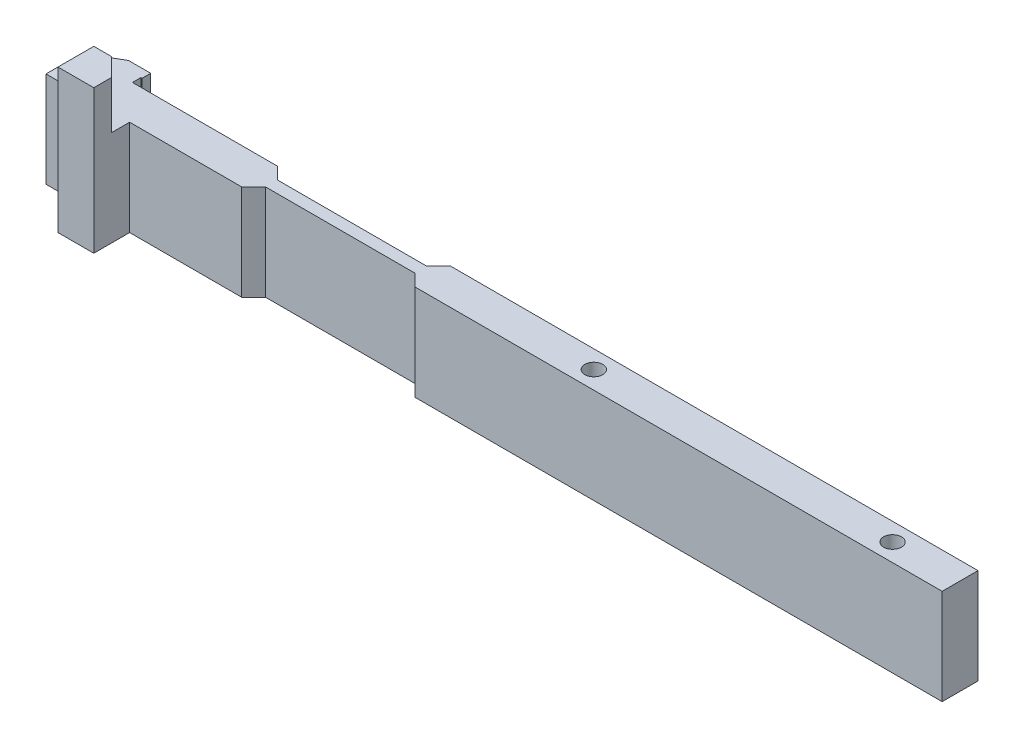
ISO-10303-21;
HEADER;
FILE_DESCRIPTION(('STEP AP214'),'2;1');
FILE_NAME('part.step','',(''),(''),'','','');
FILE_SCHEMA(('AUTOMOTIVE_DESIGN { 1 0 10303 214 1 1 1 1 }'));
ENDSEC;
DATA;
#1=APPLICATION_CONTEXT('core data for automotive mechanical design processes');
#2=APPLICATION_PROTOCOL_DEFINITION('international standard','automotive_design',2000,#1);
#3=PRODUCT_CONTEXT('',#1,'mechanical');
#4=PRODUCT('Part','Part','',(#3));
#5=PRODUCT_RELATED_PRODUCT_CATEGORY('part','',(#4));
#6=PRODUCT_DEFINITION_FORMATION('','',#4);
#7=PRODUCT_DEFINITION_CONTEXT('part definition',#1,'design');
#8=PRODUCT_DEFINITION('design','',#6,#7);
#9=PRODUCT_DEFINITION_SHAPE('','',#8);
#10=(LENGTH_UNIT() NAMED_UNIT(*) SI_UNIT(.MILLI.,.METRE.));
#11=(NAMED_UNIT(*) PLANE_ANGLE_UNIT() SI_UNIT($,.RADIAN.));
#12=(NAMED_UNIT(*) SI_UNIT($,.STERADIAN.) SOLID_ANGLE_UNIT());
#13=UNCERTAINTY_MEASURE_WITH_UNIT(LENGTH_MEASURE(1.E-05),#10,'distance_accuracy_value','');
#14=(GEOMETRIC_REPRESENTATION_CONTEXT(3) GLOBAL_UNCERTAINTY_ASSIGNED_CONTEXT((#13)) GLOBAL_UNIT_ASSIGNED_CONTEXT((#10,
#11,#12)) REPRESENTATION_CONTEXT('',''));
#15=CARTESIAN_POINT('',(0.,0.,0.));
#16=DIRECTION('',(0.,0.,1.));
#17=DIRECTION('',(1.,0.,0.));
#18=AXIS2_PLACEMENT_3D('',#15,#16,#17);
#19=CARTESIAN_POINT('',(0.,16.,0.));
#20=DIRECTION('',(0.,-1.,0.));
#21=DIRECTION('',(0.,0.,-1.));
#22=AXIS2_PLACEMENT_3D('',#19,#20,#21);
#23=PLANE('',#22);
#24=CARTESIAN_POINT('',(8.69910321486389,16.,3.00376550449415));
#25=DIRECTION('',(0.,1.,0.));
#26=DIRECTION('',(0.,0.,1.));
#27=AXIS2_PLACEMENT_3D('',#24,#25,#26);
#28=CIRCLE('',#27,1.5);
#29=CARTESIAN_POINT('',(8.69910321486389,16.,4.50376550449416));
#30=VERTEX_POINT('',#29);
#31=EDGE_CURVE('E271',#30,#30,#28,.T.);
#32=ORIENTED_EDGE('',*,*,#31,.F.);
#33=EDGE_LOOP('',(#32));
#34=FACE_BOUND('',#33,.T.);
#35=CARTESIAN_POINT('',(58.6991032148639,16.,3.00376550449415));
#36=DIRECTION('',(0.,1.,0.));
#37=DIRECTION('',(0.,0.,1.));
#38=AXIS2_PLACEMENT_3D('',#35,#36,#37);
#39=CIRCLE('',#38,1.5);
#40=CARTESIAN_POINT('',(58.6991032148639,16.,4.50376550449415));
#41=VERTEX_POINT('',#40);
#42=EDGE_CURVE('E238',#41,#41,#39,.T.);
#43=ORIENTED_EDGE('',*,*,#42,.F.);
#44=EDGE_LOOP('',(#43));
#45=FACE_BOUND('',#44,.T.);
#46=DIRECTION('',(-1.,0.,0.));
#47=VECTOR('',#46,1.);
#48=CARTESIAN_POINT('',(-72.,16.,6.));
#49=LINE('',#48,#47);
#50=CARTESIAN_POINT('',(-69.,16.,6.));
#51=VERTEX_POINT('',#50);
#52=CARTESIAN_POINT('',(-72.,16.,6.));
#53=VERTEX_POINT('',#52);
#54=EDGE_CURVE('E219',#51,#53,#49,.T.);
#55=ORIENTED_EDGE('',*,*,#54,.F.);
#56=DIRECTION('',(-0.707106781186549,0.,-0.707106781186546));
#57=VECTOR('',#56,1.);
#58=CARTESIAN_POINT('',(-69.,16.,6.));
#59=LINE('',#58,#57);
#60=CARTESIAN_POINT('',(-66.,16.,9.));
#61=VERTEX_POINT('',#60);
#62=EDGE_CURVE('E53',#61,#51,#59,.T.);
#63=ORIENTED_EDGE('',*,*,#62,.F.);
#64=DIRECTION('',(0.,0.,-1.));
#65=VECTOR('',#64,1.);
#66=CARTESIAN_POINT('',(-66.,16.,12.));
#67=LINE('',#66,#65);
#68=CARTESIAN_POINT('',(-66.,16.,6.));
#69=VERTEX_POINT('',#68);
#70=EDGE_CURVE('E57',#61,#69,#67,.T.);
#71=ORIENTED_EDGE('',*,*,#70,.T.);
#72=DIRECTION('',(1.,0.,0.));
#73=VECTOR('',#72,1.);
#74=CARTESIAN_POINT('',(-80.,16.,6.));
#75=LINE('',#74,#73);
#76=CARTESIAN_POINT('',(-47.2356614630942,16.,6.));
#77=VERTEX_POINT('',#76);
#78=EDGE_CURVE('E334',#69,#77,#75,.T.);
#79=ORIENTED_EDGE('',*,*,#78,.T.);
#80=DIRECTION('',(-0.707106781186558,0.,0.707106781186537));
#81=VECTOR('',#80,1.);
#82=CARTESIAN_POINT('',(-47.2431924720825,16.,6.00753100898831));
#83=LINE('',#82,#81);
#84=CARTESIAN_POINT('',(-45.2394269675883,16.,4.00376550449416));
#85=VERTEX_POINT('',#84);
#86=EDGE_CURVE('E286',#85,#77,#83,.T.);
#87=ORIENTED_EDGE('',*,*,#86,.F.);
#88=DIRECTION('',(-1.,0.,0.));
#89=VECTOR('',#88,1.);
#90=CARTESIAN_POINT('',(-45.2394269675883,16.,4.00376550449416));
#91=LINE('',#90,#89);
#92=CARTESIAN_POINT('',(-20.270391362817,16.,4.00376550449416));
#93=VERTEX_POINT('',#92);
#94=EDGE_CURVE('E282',#93,#85,#91,.T.);
#95=ORIENTED_EDGE('',*,*,#94,.F.);
#96=DIRECTION('',(-0.707106781186558,0.,-0.707106781186537));
#97=VECTOR('',#96,1.);
#98=CARTESIAN_POINT('',(-20.270391362817,16.,4.00376550449416));
#99=LINE('',#98,#97);
#100=CARTESIAN_POINT('',(-18.2741568673111,16.,6.));
#101=VERTEX_POINT('',#100);
#102=EDGE_CURVE('E289',#101,#93,#99,.T.);
#103=ORIENTED_EDGE('',*,*,#102,.F.);
#104=CARTESIAN_POINT('',(70.,16.,6.));
#105=VERTEX_POINT('',#104);
#106=EDGE_CURVE('E329',#101,#105,#75,.T.);
#107=ORIENTED_EDGE('',*,*,#106,.T.);
#108=DIRECTION('',(0.,0.,-1.));
#109=VECTOR('',#108,1.);
#110=CARTESIAN_POINT('',(70.,16.,6.));
#111=LINE('',#110,#109);
#112=CARTESIAN_POINT('',(70.,16.,0.));
#113=VERTEX_POINT('',#112);
#114=EDGE_CURVE('E333',#105,#113,#111,.T.);
#115=ORIENTED_EDGE('',*,*,#114,.T.);
#116=DIRECTION('',(-1.,0.,0.));
#117=VECTOR('',#116,1.);
#118=CARTESIAN_POINT('',(70.,16.,0.));
#119=LINE('',#118,#117);
#120=CARTESIAN_POINT('',(-18.2666258583228,16.,0.));
#121=VERTEX_POINT('',#120);
#122=EDGE_CURVE('E313',#113,#121,#119,.T.);
#123=ORIENTED_EDGE('',*,*,#122,.T.);
#124=DIRECTION('',(0.707106781186558,0.,-0.707106781186537));
#125=VECTOR('',#124,1.);
#126=CARTESIAN_POINT('',(-20.270391362817,16.,2.00376550449415));
#127=LINE('',#126,#125);
#128=CARTESIAN_POINT('',(-20.270391362817,16.,2.00376550449415));
#129=VERTEX_POINT('',#128);
#130=EDGE_CURVE('E261',#129,#121,#127,.T.);
#131=ORIENTED_EDGE('',*,*,#130,.F.);
#132=DIRECTION('',(1.,0.,0.));
#133=VECTOR('',#132,1.);
#134=CARTESIAN_POINT('',(-45.2394269675883,16.,2.00376550449415));
#135=LINE('',#134,#133);
#136=CARTESIAN_POINT('',(-45.2394269675883,16.,2.00376550449415));
#137=VERTEX_POINT('',#136);
#138=EDGE_CURVE('E254',#137,#129,#135,.T.);
#139=ORIENTED_EDGE('',*,*,#138,.F.);
#140=DIRECTION('',(0.707106781186558,0.,0.707106781186537));
#141=VECTOR('',#140,1.);
#142=CARTESIAN_POINT('',(-47.2431924720825,16.,0.));
#143=LINE('',#142,#141);
#144=CARTESIAN_POINT('',(-47.2431924720825,16.,0.));
#145=VERTEX_POINT('',#144);
#146=EDGE_CURVE('E263',#145,#137,#143,.T.);
#147=ORIENTED_EDGE('',*,*,#146,.F.);
#148=CARTESIAN_POINT('',(-71.5259367209433,16.,0.));
#149=VERTEX_POINT('',#148);
#150=EDGE_CURVE('E317',#145,#149,#119,.T.);
#151=ORIENTED_EDGE('',*,*,#150,.T.);
#152=DIRECTION('',(0.,0.,-1.));
#153=VECTOR('',#152,1.);
#154=CARTESIAN_POINT('',(-71.5259367209433,16.,0.));
#155=LINE('',#154,#153);
#156=CARTESIAN_POINT('',(-71.5259367209433,16.,-1.39648023141273));
#157=VERTEX_POINT('',#156);
#158=EDGE_CURVE('E316',#149,#157,#155,.T.);
#159=ORIENTED_EDGE('',*,*,#158,.T.);
#160=DIRECTION('',(1.,0.,0.));
#161=VECTOR('',#160,1.);
#162=CARTESIAN_POINT('',(-71.5259367209433,16.,-1.39648023141273));
#163=LINE('',#162,#161);
#164=CARTESIAN_POINT('',(-71.3259367209433,16.,-1.39648023141273));
#165=VERTEX_POINT('',#164);
#166=EDGE_CURVE('E319',#157,#165,#163,.T.);
#167=ORIENTED_EDGE('',*,*,#166,.T.);
#168=DIRECTION('',(0.,0.,-1.));
#169=VECTOR('',#168,1.);
#170=CARTESIAN_POINT('',(-71.3259367209433,16.,-1.39648023141273));
#171=LINE('',#170,#169);
#172=CARTESIAN_POINT('',(-71.3259367209433,16.,-2.85863640033661));
#173=VERTEX_POINT('',#172);
#174=EDGE_CURVE('E321',#165,#173,#171,.T.);
#175=ORIENTED_EDGE('',*,*,#174,.T.);
#176=DIRECTION('',(-1.,0.,0.));
#177=VECTOR('',#176,1.);
#178=CARTESIAN_POINT('',(-71.3259367209433,16.,-2.85863640033661));
#179=LINE('',#178,#177);
#180=CARTESIAN_POINT('',(-75.0356524240512,16.,-2.85863640033661));
#181=VERTEX_POINT('',#180);
#182=EDGE_CURVE('E323',#173,#181,#179,.T.);
#183=ORIENTED_EDGE('',*,*,#182,.T.);
#184=DIRECTION('',(-0.866025403784438,0.,0.5));
#185=VECTOR('',#184,1.);
#186=CARTESIAN_POINT('',(-75.0356524240512,16.,-2.85863640033661));
#187=LINE('',#186,#185);
#188=CARTESIAN_POINT('',(-80.,16.,0.0075310089883121));
#189=VERTEX_POINT('',#188);
#190=EDGE_CURVE('E325',#181,#189,#187,.T.);
#191=ORIENTED_EDGE('',*,*,#190,.T.);
#192=DIRECTION('',(0.,0.,1.));
#193=VECTOR('',#192,1.);
#194=CARTESIAN_POINT('',(-80.,16.,0.0075310089883121));
#195=LINE('',#194,#193);
#196=CARTESIAN_POINT('',(-80.,16.,6.));
#197=VERTEX_POINT('',#196);
#198=EDGE_CURVE('E327',#189,#197,#195,.T.);
#199=ORIENTED_EDGE('',*,*,#198,.T.);
#200=EDGE_CURVE('E330',#197,#53,#75,.T.);
#201=ORIENTED_EDGE('',*,*,#200,.T.);
#202=EDGE_LOOP('',(#55,#63,#71,#79,#87,#95,#103,#107,#115,#123,#131,#139,#147,#151,#159,#167,
#175,#183,#191,#199,#201));
#203=FACE_BOUND('',#202,.T.);
#204=ADVANCED_FACE('F38',(#34,#45,#203),#23,.F.);
#205=CARTESIAN_POINT('',(-80.,16.,6.));
#206=DIRECTION('',(0.,0.,-1.));
#207=DIRECTION('',(-1.,0.,0.));
#208=AXIS2_PLACEMENT_3D('',#205,#206,#207);
#209=PLANE('',#208);
#210=ORIENTED_EDGE('',*,*,#78,.F.);
#211=DIRECTION('',(0.,-1.,0.));
#212=VECTOR('',#211,1.);
#213=CARTESIAN_POINT('',(-66.,24.4852813742386,6.));
#214=LINE('',#213,#212);
#215=CARTESIAN_POINT('',(-66.,0.,6.));
#216=VERTEX_POINT('',#215);
#217=EDGE_CURVE('E239',#69,#216,#214,.T.);
#218=ORIENTED_EDGE('',*,*,#217,.T.);
#219=DIRECTION('',(1.,0.,0.));
#220=VECTOR('',#219,1.);
#221=CARTESIAN_POINT('',(-80.,0.,6.));
#222=LINE('',#221,#220);
#223=CARTESIAN_POINT('',(-47.2356614630942,0.,6.));
#224=VERTEX_POINT('',#223);
#225=EDGE_CURVE('E356',#216,#224,#222,.T.);
#226=ORIENTED_EDGE('',*,*,#225,.T.);
#227=DIRECTION('',(0.,1.,0.));
#228=VECTOR('',#227,1.);
#229=CARTESIAN_POINT('',(-47.2356614630942,16.,6.));
#230=LINE('',#229,#228);
#231=EDGE_CURVE('E309',#224,#77,#230,.T.);
#232=ORIENTED_EDGE('',*,*,#231,.T.);
#233=EDGE_LOOP('',(#210,#218,#226,#232));
#234=FACE_BOUND('',#233,.T.);
#235=ADVANCED_FACE('F435',(#234),#209,.F.);
#236=CARTESIAN_POINT('',(0.,16.,0.));
#237=DIRECTION('',(0.,0.,1.));
#238=DIRECTION('',(1.,0.,0.));
#239=AXIS2_PLACEMENT_3D('',#236,#237,#238);
#240=PLANE('',#239);
#241=DIRECTION('',(-1.,0.,0.));
#242=VECTOR('',#241,1.);
#243=CARTESIAN_POINT('',(0.,0.,0.));
#244=LINE('',#243,#242);
#245=CARTESIAN_POINT('',(70.,0.,0.));
#246=VERTEX_POINT('',#245);
#247=CARTESIAN_POINT('',(-18.2666258583228,0.,0.));
#248=VERTEX_POINT('',#247);
#249=EDGE_CURVE('E337',#246,#248,#244,.T.);
#250=ORIENTED_EDGE('',*,*,#249,.T.);
#251=DIRECTION('',(0.,1.,0.));
#252=VECTOR('',#251,1.);
#253=CARTESIAN_POINT('',(-18.2666258583228,0.,0.));
#254=LINE('',#253,#252);
#255=EDGE_CURVE('E260',#248,#121,#254,.T.);
#256=ORIENTED_EDGE('',*,*,#255,.T.);
#257=ORIENTED_EDGE('',*,*,#122,.F.);
#258=DIRECTION('',(0.,-1.,0.));
#259=VECTOR('',#258,1.);
#260=CARTESIAN_POINT('',(70.,16.,0.));
#261=LINE('',#260,#259);
#262=EDGE_CURVE('E336',#113,#246,#261,.T.);
#263=ORIENTED_EDGE('',*,*,#262,.T.);
#264=EDGE_LOOP('',(#250,#256,#257,#263));
#265=FACE_BOUND('',#264,.T.);
#266=ADVANCED_FACE('F421',(#265),#240,.F.);
#267=CARTESIAN_POINT('',(-80.,0.,6.));
#268=VERTEX_POINT('',#267);
#269=CARTESIAN_POINT('',(-72.,0.,6.));
#270=VERTEX_POINT('',#269);
#271=EDGE_CURVE('E353',#268,#270,#222,.T.);
#272=ORIENTED_EDGE('',*,*,#271,.T.);
#273=DIRECTION('',(0.,-1.,0.));
#274=VECTOR('',#273,1.);
#275=CARTESIAN_POINT('',(-72.,24.4852813742386,6.));
#276=LINE('',#275,#274);
#277=EDGE_CURVE('E246',#53,#270,#276,.T.);
#278=ORIENTED_EDGE('',*,*,#277,.F.);
#279=ORIENTED_EDGE('',*,*,#200,.F.);
#280=DIRECTION('',(0.,-1.,0.));
#281=VECTOR('',#280,1.);
#282=CARTESIAN_POINT('',(-80.,16.,6.));
#283=LINE('',#282,#281);
#284=EDGE_CURVE('E364',#197,#268,#283,.T.);
#285=ORIENTED_EDGE('',*,*,#284,.T.);
#286=EDGE_LOOP('',(#272,#278,#279,#285));
#287=FACE_BOUND('',#286,.T.);
#288=ADVANCED_FACE('F456',(#287),#209,.F.);
#289=ORIENTED_EDGE('',*,*,#150,.F.);
#290=DIRECTION('',(0.,1.,0.));
#291=VECTOR('',#290,1.);
#292=CARTESIAN_POINT('',(-47.2431924720825,0.,0.));
#293=LINE('',#292,#291);
#294=CARTESIAN_POINT('',(-47.2431924720825,0.,0.));
#295=VERTEX_POINT('',#294);
#296=EDGE_CURVE('E274',#295,#145,#293,.T.);
#297=ORIENTED_EDGE('',*,*,#296,.F.);
#298=CARTESIAN_POINT('',(-71.5259367209433,0.,0.));
#299=VERTEX_POINT('',#298);
#300=EDGE_CURVE('E312',#295,#299,#244,.T.);
#301=ORIENTED_EDGE('',*,*,#300,.T.);
#302=DIRECTION('',(0.,-1.,0.));
#303=VECTOR('',#302,1.);
#304=CARTESIAN_POINT('',(-71.5259367209433,16.,0.));
#305=LINE('',#304,#303);
#306=EDGE_CURVE('E46',#149,#299,#305,.T.);
#307=ORIENTED_EDGE('',*,*,#306,.F.);
#308=EDGE_LOOP('',(#289,#297,#301,#307));
#309=FACE_BOUND('',#308,.T.);
#310=ADVANCED_FACE('F40',(#309),#240,.F.);
#311=CARTESIAN_POINT('',(-71.5259367209433,16.,0.));
#312=DIRECTION('',(-1.,0.,0.));
#313=DIRECTION('',(0.,0.,1.));
#314=AXIS2_PLACEMENT_3D('',#311,#312,#313);
#315=PLANE('',#314);
#316=DIRECTION('',(0.,0.,-1.));
#317=VECTOR('',#316,1.);
#318=CARTESIAN_POINT('',(-71.5259367209433,0.,0.));
#319=LINE('',#318,#317);
#320=CARTESIAN_POINT('',(-71.5259367209433,0.,-1.39648023141273));
#321=VERTEX_POINT('',#320);
#322=EDGE_CURVE('E340',#299,#321,#319,.T.);
#323=ORIENTED_EDGE('',*,*,#322,.T.);
#324=DIRECTION('',(0.,-1.,0.));
#325=VECTOR('',#324,1.);
#326=CARTESIAN_POINT('',(-71.5259367209433,16.,-1.39648023141273));
#327=LINE('',#326,#325);
#328=EDGE_CURVE('E379',#157,#321,#327,.T.);
#329=ORIENTED_EDGE('',*,*,#328,.F.);
#330=ORIENTED_EDGE('',*,*,#158,.F.);
#331=ORIENTED_EDGE('',*,*,#306,.T.);
#332=EDGE_LOOP('',(#323,#329,#330,#331));
#333=FACE_BOUND('',#332,.T.);
#334=ADVANCED_FACE('F386',(#333),#315,.F.);
#335=CARTESIAN_POINT('',(-71.5259367209433,16.,-1.39648023141273));
#336=DIRECTION('',(0.,0.,-1.));
#337=DIRECTION('',(-1.,0.,0.));
#338=AXIS2_PLACEMENT_3D('',#335,#336,#337);
#339=PLANE('',#338);
#340=DIRECTION('',(1.,0.,0.));
#341=VECTOR('',#340,1.);
#342=CARTESIAN_POINT('',(-71.5259367209433,0.,-1.39648023141273));
#343=LINE('',#342,#341);
#344=CARTESIAN_POINT('',(-71.3259367209433,0.,-1.39648023141273));
#345=VERTEX_POINT('',#344);
#346=EDGE_CURVE('E342',#321,#345,#343,.T.);
#347=ORIENTED_EDGE('',*,*,#346,.T.);
#348=DIRECTION('',(0.,-1.,0.));
#349=VECTOR('',#348,1.);
#350=CARTESIAN_POINT('',(-71.3259367209433,16.,-1.39648023141273));
#351=LINE('',#350,#349);
#352=EDGE_CURVE('E376',#165,#345,#351,.T.);
#353=ORIENTED_EDGE('',*,*,#352,.F.);
#354=ORIENTED_EDGE('',*,*,#166,.F.);
#355=ORIENTED_EDGE('',*,*,#328,.T.);
#356=EDGE_LOOP('',(#347,#353,#354,#355));
#357=FACE_BOUND('',#356,.T.);
#358=ADVANCED_FACE('F399',(#357),#339,.F.);
#359=CARTESIAN_POINT('',(-71.3259367209433,16.,-1.39648023141273));
#360=DIRECTION('',(-1.,0.,0.));
#361=DIRECTION('',(0.,0.,1.));
#362=AXIS2_PLACEMENT_3D('',#359,#360,#361);
#363=PLANE('',#362);
#364=DIRECTION('',(0.,0.,-1.));
#365=VECTOR('',#364,1.);
#366=CARTESIAN_POINT('',(-71.3259367209433,0.,-1.39648023141273));
#367=LINE('',#366,#365);
#368=CARTESIAN_POINT('',(-71.3259367209433,0.,-2.85863640033661));
#369=VERTEX_POINT('',#368);
#370=EDGE_CURVE('E344',#345,#369,#367,.T.);
#371=ORIENTED_EDGE('',*,*,#370,.T.);
#372=DIRECTION('',(0.,-1.,0.));
#373=VECTOR('',#372,1.);
#374=CARTESIAN_POINT('',(-71.3259367209433,16.,-2.85863640033661));
#375=LINE('',#374,#373);
#376=EDGE_CURVE('E373',#173,#369,#375,.T.);
#377=ORIENTED_EDGE('',*,*,#376,.F.);
#378=ORIENTED_EDGE('',*,*,#174,.F.);
#379=ORIENTED_EDGE('',*,*,#352,.T.);
#380=EDGE_LOOP('',(#371,#377,#378,#379));
#381=FACE_BOUND('',#380,.T.);
#382=ADVANCED_FACE('F403',(#381),#363,.F.);
#383=CARTESIAN_POINT('',(-71.3259367209433,16.,-2.85863640033661));
#384=DIRECTION('',(0.,0.,1.));
#385=DIRECTION('',(1.,0.,0.));
#386=AXIS2_PLACEMENT_3D('',#383,#384,#385);
#387=PLANE('',#386);
#388=DIRECTION('',(-1.,0.,0.));
#389=VECTOR('',#388,1.);
#390=CARTESIAN_POINT('',(-71.3259367209433,0.,-2.85863640033661));
#391=LINE('',#390,#389);
#392=CARTESIAN_POINT('',(-75.0356524240512,0.,-2.85863640033661));
#393=VERTEX_POINT('',#392);
#394=EDGE_CURVE('E346',#369,#393,#391,.T.);
#395=ORIENTED_EDGE('',*,*,#394,.T.);
#396=DIRECTION('',(0.,-1.,0.));
#397=VECTOR('',#396,1.);
#398=CARTESIAN_POINT('',(-75.0356524240512,16.,-2.85863640033661));
#399=LINE('',#398,#397);
#400=EDGE_CURVE('E370',#181,#393,#399,.T.);
#401=ORIENTED_EDGE('',*,*,#400,.F.);
#402=ORIENTED_EDGE('',*,*,#182,.F.);
#403=ORIENTED_EDGE('',*,*,#376,.T.);
#404=EDGE_LOOP('',(#395,#401,#402,#403));
#405=FACE_BOUND('',#404,.T.);
#406=ADVANCED_FACE('F500',(#405),#387,.F.);
#407=CARTESIAN_POINT('',(-75.0356524240512,16.,-2.85863640033661));
#408=DIRECTION('',(0.5,0.,0.866025403784438));
#409=DIRECTION('',(0.866025403784439,0.,-0.5));
#410=AXIS2_PLACEMENT_3D('',#407,#408,#409);
#411=PLANE('',#410);
#412=DIRECTION('',(-0.866025403784438,0.,0.5));
#413=VECTOR('',#412,1.);
#414=CARTESIAN_POINT('',(-75.0356524240512,0.,-2.85863640033661));
#415=LINE('',#414,#413);
#416=CARTESIAN_POINT('',(-80.,0.,0.0075310089883121));
#417=VERTEX_POINT('',#416);
#418=EDGE_CURVE('E348',#393,#417,#415,.T.);
#419=ORIENTED_EDGE('',*,*,#418,.T.);
#420=DIRECTION('',(0.,-1.,0.));
#421=VECTOR('',#420,1.);
#422=CARTESIAN_POINT('',(-80.,16.,0.0075310089883121));
#423=LINE('',#422,#421);
#424=EDGE_CURVE('E367',#189,#417,#423,.T.);
#425=ORIENTED_EDGE('',*,*,#424,.F.);
#426=ORIENTED_EDGE('',*,*,#190,.F.);
#427=ORIENTED_EDGE('',*,*,#400,.T.);
#428=EDGE_LOOP('',(#419,#425,#426,#427));
#429=FACE_BOUND('',#428,.T.);
#430=ADVANCED_FACE('F496',(#429),#411,.F.);
#431=CARTESIAN_POINT('',(-80.,16.,0.0075310089883121));
#432=DIRECTION('',(1.,0.,0.));
#433=DIRECTION('',(0.,0.,-1.));
#434=AXIS2_PLACEMENT_3D('',#431,#432,#433);
#435=PLANE('',#434);
#436=DIRECTION('',(0.,0.,1.));
#437=VECTOR('',#436,1.);
#438=CARTESIAN_POINT('',(-80.,0.,0.0075310089883121));
#439=LINE('',#438,#437);
#440=EDGE_CURVE('E350',#417,#268,#439,.T.);
#441=ORIENTED_EDGE('',*,*,#440,.T.);
#442=ORIENTED_EDGE('',*,*,#284,.F.);
#443=ORIENTED_EDGE('',*,*,#198,.F.);
#444=ORIENTED_EDGE('',*,*,#424,.T.);
#445=EDGE_LOOP('',(#441,#442,#443,#444));
#446=FACE_BOUND('',#445,.T.);
#447=ADVANCED_FACE('F493',(#446),#435,.F.);
#448=ORIENTED_EDGE('',*,*,#106,.F.);
#449=DIRECTION('',(0.,-1.,0.));
#450=VECTOR('',#449,1.);
#451=CARTESIAN_POINT('',(-18.2741568673111,16.,6.));
#452=LINE('',#451,#450);
#453=CARTESIAN_POINT('',(-18.2741568673111,0.,6.));
#454=VERTEX_POINT('',#453);
#455=EDGE_CURVE('E304',#101,#454,#452,.T.);
#456=ORIENTED_EDGE('',*,*,#455,.T.);
#457=CARTESIAN_POINT('',(70.,0.,6.));
#458=VERTEX_POINT('',#457);
#459=EDGE_CURVE('E352',#454,#458,#222,.T.);
#460=ORIENTED_EDGE('',*,*,#459,.T.);
#461=DIRECTION('',(0.,-1.,0.));
#462=VECTOR('',#461,1.);
#463=CARTESIAN_POINT('',(70.,16.,6.));
#464=LINE('',#463,#462);
#465=EDGE_CURVE('E361',#105,#458,#464,.T.);
#466=ORIENTED_EDGE('',*,*,#465,.F.);
#467=EDGE_LOOP('',(#448,#456,#460,#466));
#468=FACE_BOUND('',#467,.T.);
#469=ADVANCED_FACE('F447',(#468),#209,.F.);
#470=CARTESIAN_POINT('',(70.,16.,6.));
#471=DIRECTION('',(-1.,0.,0.));
#472=DIRECTION('',(0.,0.,1.));
#473=AXIS2_PLACEMENT_3D('',#470,#471,#472);
#474=PLANE('',#473);
#475=DIRECTION('',(0.,0.,-1.));
#476=VECTOR('',#475,1.);
#477=CARTESIAN_POINT('',(70.,0.,6.));
#478=LINE('',#477,#476);
#479=EDGE_CURVE('E355',#458,#246,#478,.T.);
#480=ORIENTED_EDGE('',*,*,#479,.T.);
#481=ORIENTED_EDGE('',*,*,#262,.F.);
#482=ORIENTED_EDGE('',*,*,#114,.F.);
#483=ORIENTED_EDGE('',*,*,#465,.T.);
#484=EDGE_LOOP('',(#480,#481,#482,#483));
#485=FACE_BOUND('',#484,.T.);
#486=ADVANCED_FACE('F428',(#485),#474,.F.);
#487=CARTESIAN_POINT('',(0.,0.,0.));
#488=DIRECTION('',(0.,-1.,0.));
#489=DIRECTION('',(0.,0.,-1.));
#490=AXIS2_PLACEMENT_3D('',#487,#488,#489);
#491=PLANE('',#490);
#492=CARTESIAN_POINT('',(58.6991032148639,0.,3.00376550449415));
#493=DIRECTION('',(0.,1.,0.));
#494=DIRECTION('',(0.,0.,1.));
#495=AXIS2_PLACEMENT_3D('',#492,#493,#494);
#496=CIRCLE('',#495,1.5);
#497=CARTESIAN_POINT('',(58.6991032148639,0.,4.50376550449415));
#498=VERTEX_POINT('',#497);
#499=EDGE_CURVE('E290',#498,#498,#496,.T.);
#500=ORIENTED_EDGE('',*,*,#499,.T.);
#501=EDGE_LOOP('',(#500));
#502=FACE_BOUND('',#501,.T.);
#503=DIRECTION('',(-0.707106781186558,0.,0.707106781186537));
#504=VECTOR('',#503,1.);
#505=CARTESIAN_POINT('',(-47.2431924720825,0.,6.00753100898831));
#506=LINE('',#505,#504);
#507=CARTESIAN_POINT('',(-45.2394269675883,0.,4.00376550449416));
#508=VERTEX_POINT('',#507);
#509=EDGE_CURVE('E278',#508,#224,#506,.T.);
#510=ORIENTED_EDGE('',*,*,#509,.T.);
#511=ORIENTED_EDGE('',*,*,#225,.F.);
#512=DIRECTION('',(0.,0.,1.));
#513=VECTOR('',#512,1.);
#514=CARTESIAN_POINT('',(-66.,0.,12.));
#515=LINE('',#514,#513);
#516=CARTESIAN_POINT('',(-66.,0.,12.));
#517=VERTEX_POINT('',#516);
#518=EDGE_CURVE('E236',#216,#517,#515,.T.);
#519=ORIENTED_EDGE('',*,*,#518,.T.);
#520=DIRECTION('',(-1.,0.,0.));
#521=VECTOR('',#520,1.);
#522=CARTESIAN_POINT('',(-72.,0.,12.));
#523=LINE('',#522,#521);
#524=CARTESIAN_POINT('',(-72.,0.,12.));
#525=VERTEX_POINT('',#524);
#526=EDGE_CURVE('E199',#517,#525,#523,.T.);
#527=ORIENTED_EDGE('',*,*,#526,.T.);
#528=DIRECTION('',(0.,0.,-1.));
#529=VECTOR('',#528,1.);
#530=CARTESIAN_POINT('',(-72.,0.,12.));
#531=LINE('',#530,#529);
#532=EDGE_CURVE('E204',#525,#270,#531,.T.);
#533=ORIENTED_EDGE('',*,*,#532,.T.);
#534=ORIENTED_EDGE('',*,*,#271,.F.);
#535=ORIENTED_EDGE('',*,*,#440,.F.);
#536=ORIENTED_EDGE('',*,*,#418,.F.);
#537=ORIENTED_EDGE('',*,*,#394,.F.);
#538=ORIENTED_EDGE('',*,*,#370,.F.);
#539=ORIENTED_EDGE('',*,*,#346,.F.);
#540=ORIENTED_EDGE('',*,*,#322,.F.);
#541=ORIENTED_EDGE('',*,*,#300,.F.);
#542=DIRECTION('',(0.707106781186558,0.,0.707106781186537));
#543=VECTOR('',#542,1.);
#544=CARTESIAN_POINT('',(-47.2431924720825,0.,0.));
#545=LINE('',#544,#543);
#546=CARTESIAN_POINT('',(-45.2394269675883,0.,2.00376550449415));
#547=VERTEX_POINT('',#546);
#548=EDGE_CURVE('E253',#295,#547,#545,.T.);
#549=ORIENTED_EDGE('',*,*,#548,.T.);
#550=DIRECTION('',(1.,0.,0.));
#551=VECTOR('',#550,1.);
#552=CARTESIAN_POINT('',(-45.2394269675883,0.,2.00376550449415));
#553=LINE('',#552,#551);
#554=CARTESIAN_POINT('',(-20.270391362817,0.,2.00376550449415));
#555=VERTEX_POINT('',#554);
#556=EDGE_CURVE('E257',#547,#555,#553,.T.);
#557=ORIENTED_EDGE('',*,*,#556,.T.);
#558=DIRECTION('',(0.707106781186558,0.,-0.707106781186537));
#559=VECTOR('',#558,1.);
#560=CARTESIAN_POINT('',(-20.270391362817,0.,2.00376550449415));
#561=LINE('',#560,#559);
#562=EDGE_CURVE('E250',#555,#248,#561,.T.);
#563=ORIENTED_EDGE('',*,*,#562,.T.);
#564=ORIENTED_EDGE('',*,*,#249,.F.);
#565=ORIENTED_EDGE('',*,*,#479,.F.);
#566=ORIENTED_EDGE('',*,*,#459,.F.);
#567=DIRECTION('',(0.707106781186558,0.,0.707106781186537));
#568=VECTOR('',#567,1.);
#569=CARTESIAN_POINT('',(-12.1370784336553,0.,12.1370784336556));
#570=LINE('',#569,#568);
#571=CARTESIAN_POINT('',(-20.270391362817,0.,4.00376550449416));
#572=VERTEX_POINT('',#571);
#573=EDGE_CURVE('E11',#572,#454,#570,.T.);
#574=ORIENTED_EDGE('',*,*,#573,.F.);
#575=DIRECTION('',(-1.,0.,0.));
#576=VECTOR('',#575,1.);
#577=CARTESIAN_POINT('',(-45.2394269675883,0.,4.00376550449416));
#578=LINE('',#577,#576);
#579=EDGE_CURVE('E281',#572,#508,#578,.T.);
#580=ORIENTED_EDGE('',*,*,#579,.T.);
#581=EDGE_LOOP('',(#510,#511,#519,#527,#533,#534,#535,#536,#537,#538,#539,#540,#541,#549,#557,
#563,#564,#565,#566,#574,#580));
#582=FACE_BOUND('',#581,.T.);
#583=CARTESIAN_POINT('',(8.69910321486389,0.,3.00376550449415));
#584=DIRECTION('',(0.,1.,0.));
#585=DIRECTION('',(0.,0.,1.));
#586=AXIS2_PLACEMENT_3D('',#583,#584,#585);
#587=CIRCLE('',#586,1.5);
#588=CARTESIAN_POINT('',(8.69910321486389,0.,4.50376550449416));
#589=VERTEX_POINT('',#588);
#590=EDGE_CURVE('E301',#589,#589,#587,.T.);
#591=ORIENTED_EDGE('',*,*,#590,.T.);
#592=EDGE_LOOP('',(#591));
#593=FACE_BOUND('',#592,.T.);
#594=ADVANCED_FACE('F393',(#502,#582,#593),#491,.T.);
#595=CARTESIAN_POINT('',(8.69910321486389,0.,3.00376550449415));
#596=DIRECTION('',(0.,1.,0.));
#597=DIRECTION('',(0.,0.,1.));
#598=AXIS2_PLACEMENT_3D('',#595,#596,#597);
#599=CYLINDRICAL_SURFACE('',#598,1.5);
#600=ORIENTED_EDGE('',*,*,#590,.F.);
#601=EDGE_LOOP('',(#600));
#602=FACE_BOUND('',#601,.T.);
#603=ORIENTED_EDGE('',*,*,#31,.T.);
#604=EDGE_LOOP('',(#603));
#605=FACE_BOUND('',#604,.T.);
#606=ADVANCED_FACE('F485',(#602,#605),#599,.F.);
#607=CARTESIAN_POINT('',(-20.270391362817,0.,2.00376550449415));
#608=DIRECTION('',(0.707106781186537,0.,0.707106781186558));
#609=DIRECTION('',(0.707106781186558,0.,-0.707106781186537));
#610=AXIS2_PLACEMENT_3D('',#607,#608,#609);
#611=PLANE('',#610);
#612=ORIENTED_EDGE('',*,*,#130,.T.);
#613=ORIENTED_EDGE('',*,*,#255,.F.);
#614=ORIENTED_EDGE('',*,*,#562,.F.);
#615=DIRECTION('',(0.,1.,0.));
#616=VECTOR('',#615,1.);
#617=CARTESIAN_POINT('',(-20.270391362817,0.,2.00376550449415));
#618=LINE('',#617,#616);
#619=EDGE_CURVE('E269',#555,#129,#618,.T.);
#620=ORIENTED_EDGE('',*,*,#619,.T.);
#621=EDGE_LOOP('',(#612,#613,#614,#620));
#622=FACE_BOUND('',#621,.T.);
#623=ADVANCED_FACE('F418',(#622),#611,.F.);
#624=CARTESIAN_POINT('',(-45.2394269675883,0.,2.00376550449415));
#625=DIRECTION('',(0.,0.,1.));
#626=DIRECTION('',(1.,0.,0.));
#627=AXIS2_PLACEMENT_3D('',#624,#625,#626);
#628=PLANE('',#627);
#629=ORIENTED_EDGE('',*,*,#138,.T.);
#630=ORIENTED_EDGE('',*,*,#619,.F.);
#631=ORIENTED_EDGE('',*,*,#556,.F.);
#632=DIRECTION('',(0.,1.,0.));
#633=VECTOR('',#632,1.);
#634=CARTESIAN_POINT('',(-45.2394269675883,0.,2.00376550449415));
#635=LINE('',#634,#633);
#636=EDGE_CURVE('E272',#547,#137,#635,.T.);
#637=ORIENTED_EDGE('',*,*,#636,.T.);
#638=EDGE_LOOP('',(#629,#630,#631,#637));
#639=FACE_BOUND('',#638,.T.);
#640=ADVANCED_FACE('F415',(#639),#628,.F.);
#641=CARTESIAN_POINT('',(-47.2431924720825,0.,0.));
#642=DIRECTION('',(-0.707106781186537,0.,0.707106781186558));
#643=DIRECTION('',(0.707106781186558,0.,0.707106781186537));
#644=AXIS2_PLACEMENT_3D('',#641,#642,#643);
#645=PLANE('',#644);
#646=ORIENTED_EDGE('',*,*,#146,.T.);
#647=ORIENTED_EDGE('',*,*,#636,.F.);
#648=ORIENTED_EDGE('',*,*,#548,.F.);
#649=ORIENTED_EDGE('',*,*,#296,.T.);
#650=EDGE_LOOP('',(#646,#647,#648,#649));
#651=FACE_BOUND('',#650,.T.);
#652=ADVANCED_FACE('F411',(#651),#645,.F.);
#653=CARTESIAN_POINT('',(-47.2431924720825,0.,6.00753100898831));
#654=DIRECTION('',(-0.707106781186537,0.,-0.707106781186558));
#655=DIRECTION('',(-0.707106781186558,0.,0.707106781186537));
#656=AXIS2_PLACEMENT_3D('',#653,#654,#655);
#657=PLANE('',#656);
#658=ORIENTED_EDGE('',*,*,#509,.F.);
#659=DIRECTION('',(0.,1.,0.));
#660=VECTOR('',#659,1.);
#661=CARTESIAN_POINT('',(-45.2394269675883,0.,4.00376550449416));
#662=LINE('',#661,#660);
#663=EDGE_CURVE('E264',#508,#85,#662,.T.);
#664=ORIENTED_EDGE('',*,*,#663,.T.);
#665=ORIENTED_EDGE('',*,*,#86,.T.);
#666=ORIENTED_EDGE('',*,*,#231,.F.);
#667=EDGE_LOOP('',(#658,#664,#665,#666));
#668=FACE_BOUND('',#667,.T.);
#669=ADVANCED_FACE('F439',(#668),#657,.F.);
#670=CARTESIAN_POINT('',(-20.270391362817,0.,4.00376550449416));
#671=DIRECTION('',(0.707106781186537,0.,-0.707106781186558));
#672=DIRECTION('',(-0.707106781186558,0.,-0.707106781186537));
#673=AXIS2_PLACEMENT_3D('',#670,#671,#672);
#674=PLANE('',#673);
#675=ORIENTED_EDGE('',*,*,#102,.T.);
#676=DIRECTION('',(0.,1.,0.));
#677=VECTOR('',#676,1.);
#678=CARTESIAN_POINT('',(-20.270391362817,0.,4.00376550449416));
#679=LINE('',#678,#677);
#680=EDGE_CURVE('E285',#572,#93,#679,.T.);
#681=ORIENTED_EDGE('',*,*,#680,.F.);
#682=ORIENTED_EDGE('',*,*,#573,.T.);
#683=ORIENTED_EDGE('',*,*,#455,.F.);
#684=EDGE_LOOP('',(#675,#681,#682,#683));
#685=FACE_BOUND('',#684,.T.);
#686=ADVANCED_FACE('F446',(#685),#674,.F.);
#687=CARTESIAN_POINT('',(-45.2394269675883,0.,4.00376550449416));
#688=DIRECTION('',(0.,0.,-1.));
#689=DIRECTION('',(-1.,0.,0.));
#690=AXIS2_PLACEMENT_3D('',#687,#688,#689);
#691=PLANE('',#690);
#692=ORIENTED_EDGE('',*,*,#94,.T.);
#693=ORIENTED_EDGE('',*,*,#663,.F.);
#694=ORIENTED_EDGE('',*,*,#579,.F.);
#695=ORIENTED_EDGE('',*,*,#680,.T.);
#696=EDGE_LOOP('',(#692,#693,#694,#695));
#697=FACE_BOUND('',#696,.T.);
#698=ADVANCED_FACE('F443',(#697),#691,.F.);
#699=CARTESIAN_POINT('',(58.6991032148639,0.,3.00376550449415));
#700=DIRECTION('',(0.,1.,0.));
#701=DIRECTION('',(0.,0.,1.));
#702=AXIS2_PLACEMENT_3D('',#699,#700,#701);
#703=CYLINDRICAL_SURFACE('',#702,1.5);
#704=ORIENTED_EDGE('',*,*,#499,.F.);
#705=EDGE_LOOP('',(#704));
#706=FACE_BOUND('',#705,.T.);
#707=ORIENTED_EDGE('',*,*,#42,.T.);
#708=EDGE_LOOP('',(#707));
#709=FACE_BOUND('',#708,.T.);
#710=ADVANCED_FACE('F539',(#706,#709),#703,.F.);
#711=CARTESIAN_POINT('',(-66.,24.4852813742386,12.));
#712=DIRECTION('',(1.,0.,0.));
#713=DIRECTION('',(0.,0.,-1.));
#714=AXIS2_PLACEMENT_3D('',#711,#712,#713);
#715=PLANE('',#714);
#716=ORIENTED_EDGE('',*,*,#70,.F.);
#717=DIRECTION('',(0.,-1.,0.));
#718=VECTOR('',#717,1.);
#719=CARTESIAN_POINT('',(-66.,24.,9.));
#720=LINE('',#719,#718);
#721=CARTESIAN_POINT('',(-66.,24.,9.));
#722=VERTEX_POINT('',#721);
#723=EDGE_CURVE('E210',#722,#61,#720,.T.);
#724=ORIENTED_EDGE('',*,*,#723,.F.);
#725=DIRECTION('',(0.,0.,-1.));
#726=VECTOR('',#725,1.);
#727=CARTESIAN_POINT('',(-66.,24.,9.));
#728=LINE('',#727,#726);
#729=CARTESIAN_POINT('',(-66.,24.,12.));
#730=VERTEX_POINT('',#729);
#731=EDGE_CURVE('E207',#730,#722,#728,.T.);
#732=ORIENTED_EDGE('',*,*,#731,.F.);
#733=DIRECTION('',(0.,-1.,0.));
#734=VECTOR('',#733,1.);
#735=CARTESIAN_POINT('',(-66.,24.4852813742386,12.));
#736=LINE('',#735,#734);
#737=EDGE_CURVE('E193',#730,#517,#736,.T.);
#738=ORIENTED_EDGE('',*,*,#737,.T.);
#739=ORIENTED_EDGE('',*,*,#518,.F.);
#740=ORIENTED_EDGE('',*,*,#217,.F.);
#741=EDGE_LOOP('',(#716,#724,#732,#738,#739,#740));
#742=FACE_BOUND('',#741,.T.);
#743=ADVANCED_FACE('F208',(#742),#715,.T.);
#744=CARTESIAN_POINT('',(-72.,24.4852813742386,12.));
#745=DIRECTION('',(-1.,0.,0.));
#746=DIRECTION('',(0.,0.,1.));
#747=AXIS2_PLACEMENT_3D('',#744,#745,#746);
#748=PLANE('',#747);
#749=DIRECTION('',(0.,-1.,0.));
#750=VECTOR('',#749,1.);
#751=CARTESIAN_POINT('',(-72.,24.4852813742386,12.));
#752=LINE('',#751,#750);
#753=CARTESIAN_POINT('',(-72.,24.,12.));
#754=VERTEX_POINT('',#753);
#755=EDGE_CURVE('E203',#754,#525,#752,.T.);
#756=ORIENTED_EDGE('',*,*,#755,.F.);
#757=DIRECTION('',(0.,0.,1.));
#758=VECTOR('',#757,1.);
#759=CARTESIAN_POINT('',(-72.,24.,12.));
#760=LINE('',#759,#758);
#761=CARTESIAN_POINT('',(-72.,24.,6.));
#762=VERTEX_POINT('',#761);
#763=EDGE_CURVE('E218',#762,#754,#760,.T.);
#764=ORIENTED_EDGE('',*,*,#763,.F.);
#765=DIRECTION('',(0.,-1.,0.));
#766=VECTOR('',#765,1.);
#767=CARTESIAN_POINT('',(-72.,24.,6.));
#768=LINE('',#767,#766);
#769=EDGE_CURVE('E228',#762,#53,#768,.T.);
#770=ORIENTED_EDGE('',*,*,#769,.T.);
#771=ORIENTED_EDGE('',*,*,#277,.T.);
#772=ORIENTED_EDGE('',*,*,#532,.F.);
#773=EDGE_LOOP('',(#756,#764,#770,#771,#772));
#774=FACE_BOUND('',#773,.T.);
#775=ADVANCED_FACE('F452',(#774),#748,.T.);
#776=CARTESIAN_POINT('',(-72.,24.4852813742386,12.));
#777=DIRECTION('',(0.,0.,1.));
#778=DIRECTION('',(1.,0.,0.));
#779=AXIS2_PLACEMENT_3D('',#776,#777,#778);
#780=PLANE('',#779);
#781=ORIENTED_EDGE('',*,*,#737,.F.);
#782=DIRECTION('',(1.,0.,0.));
#783=VECTOR('',#782,1.);
#784=CARTESIAN_POINT('',(-66.,24.,12.));
#785=LINE('',#784,#783);
#786=EDGE_CURVE('E197',#754,#730,#785,.T.);
#787=ORIENTED_EDGE('',*,*,#786,.F.);
#788=ORIENTED_EDGE('',*,*,#755,.T.);
#789=ORIENTED_EDGE('',*,*,#526,.F.);
#790=EDGE_LOOP('',(#781,#787,#788,#789));
#791=FACE_BOUND('',#790,.T.);
#792=ADVANCED_FACE('F195',(#791),#780,.T.);
#793=CARTESIAN_POINT('',(-69.,24.,6.));
#794=DIRECTION('',(-0.707106781186546,0.,0.707106781186549));
#795=DIRECTION('',(0.707106781186549,0.,0.707106781186546));
#796=AXIS2_PLACEMENT_3D('',#793,#794,#795);
#797=PLANE('',#796);
#798=ORIENTED_EDGE('',*,*,#62,.T.);
#799=DIRECTION('',(0.,-1.,0.));
#800=VECTOR('',#799,1.);
#801=CARTESIAN_POINT('',(-69.,24.,6.));
#802=LINE('',#801,#800);
#803=CARTESIAN_POINT('',(-69.,24.,6.));
#804=VERTEX_POINT('',#803);
#805=EDGE_CURVE('E232',#804,#51,#802,.T.);
#806=ORIENTED_EDGE('',*,*,#805,.F.);
#807=DIRECTION('',(-0.707106781186549,0.,-0.707106781186546));
#808=VECTOR('',#807,1.);
#809=CARTESIAN_POINT('',(-69.,24.,6.));
#810=LINE('',#809,#808);
#811=EDGE_CURVE('E213',#722,#804,#810,.T.);
#812=ORIENTED_EDGE('',*,*,#811,.F.);
#813=ORIENTED_EDGE('',*,*,#723,.T.);
#814=EDGE_LOOP('',(#798,#806,#812,#813));
#815=FACE_BOUND('',#814,.T.);
#816=ADVANCED_FACE('F464',(#815),#797,.F.);
#817=CARTESIAN_POINT('',(-72.,24.,6.));
#818=DIRECTION('',(0.,0.,1.));
#819=DIRECTION('',(1.,0.,0.));
#820=AXIS2_PLACEMENT_3D('',#817,#818,#819);
#821=PLANE('',#820);
#822=ORIENTED_EDGE('',*,*,#54,.T.);
#823=ORIENTED_EDGE('',*,*,#769,.F.);
#824=DIRECTION('',(-1.,0.,0.));
#825=VECTOR('',#824,1.);
#826=CARTESIAN_POINT('',(-72.,24.,6.));
#827=LINE('',#826,#825);
#828=EDGE_CURVE('E225',#804,#762,#827,.T.);
#829=ORIENTED_EDGE('',*,*,#828,.F.);
#830=ORIENTED_EDGE('',*,*,#805,.T.);
#831=EDGE_LOOP('',(#822,#823,#829,#830));
#832=FACE_BOUND('',#831,.T.);
#833=ADVANCED_FACE('F460',(#832),#821,.F.);
#834=CARTESIAN_POINT('',(0.,24.,0.));
#835=DIRECTION('',(0.,-1.,0.));
#836=DIRECTION('',(0.,0.,-1.));
#837=AXIS2_PLACEMENT_3D('',#834,#835,#836);
#838=PLANE('',#837);
#839=ORIENTED_EDGE('',*,*,#786,.T.);
#840=ORIENTED_EDGE('',*,*,#731,.T.);
#841=ORIENTED_EDGE('',*,*,#811,.T.);
#842=ORIENTED_EDGE('',*,*,#828,.T.);
#843=ORIENTED_EDGE('',*,*,#763,.T.);
#844=EDGE_LOOP('',(#839,#840,#841,#842,#843));
#845=FACE_BOUND('',#844,.T.);
#846=ADVANCED_FACE('F216',(#845),#838,.F.);
#847=CLOSED_SHELL('',(#204,#235,#266,#288,#310,#334,#358,#382,#406,#430,#447,#469,#486,#594,
#606,#623,#640,#652,#669,#686,#698,#710,#743,#775,#792,#816,#833,#846));
#848=MANIFOLD_SOLID_BREP('B2',#847);
#849=ADVANCED_BREP_SHAPE_REPRESENTATION('',(#18,#848),#14);
#850=SHAPE_DEFINITION_REPRESENTATION(#9,#849);
ENDSEC;
END-ISO-10303-21;
